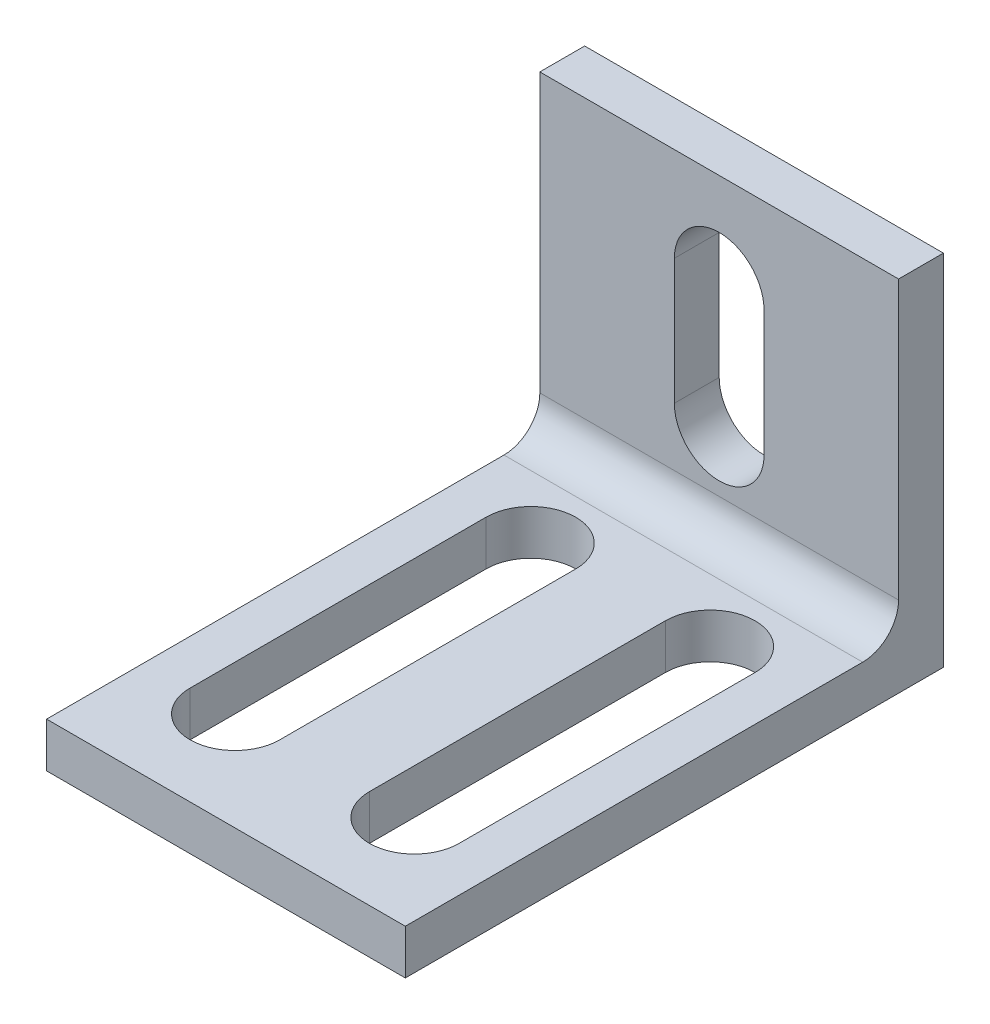
ISO-10303-21;
HEADER;
FILE_DESCRIPTION(('STEP AP214'),'2;1');
FILE_NAME('part.step','',(''),(''),'','','');
FILE_SCHEMA(('AUTOMOTIVE_DESIGN { 1 0 10303 214 1 1 1 1 }'));
ENDSEC;
DATA;
#1=APPLICATION_CONTEXT('core data for automotive mechanical design processes');
#2=APPLICATION_PROTOCOL_DEFINITION('international standard','automotive_design',2000,#1);
#3=PRODUCT_CONTEXT('',#1,'mechanical');
#4=PRODUCT('Part','Part','',(#3));
#5=PRODUCT_RELATED_PRODUCT_CATEGORY('part','',(#4));
#6=PRODUCT_DEFINITION_FORMATION('','',#4);
#7=PRODUCT_DEFINITION_CONTEXT('part definition',#1,'design');
#8=PRODUCT_DEFINITION('design','',#6,#7);
#9=PRODUCT_DEFINITION_SHAPE('','',#8);
#10=(LENGTH_UNIT() NAMED_UNIT(*) SI_UNIT(.MILLI.,.METRE.));
#11=(NAMED_UNIT(*) PLANE_ANGLE_UNIT() SI_UNIT($,.RADIAN.));
#12=(NAMED_UNIT(*) SI_UNIT($,.STERADIAN.) SOLID_ANGLE_UNIT());
#13=UNCERTAINTY_MEASURE_WITH_UNIT(LENGTH_MEASURE(1.E-05),#10,'distance_accuracy_value','');
#14=(GEOMETRIC_REPRESENTATION_CONTEXT(3) GLOBAL_UNCERTAINTY_ASSIGNED_CONTEXT((#13)) GLOBAL_UNIT_ASSIGNED_CONTEXT((#10,
#11,#12)) REPRESENTATION_CONTEXT('',''));
#15=CARTESIAN_POINT('',(0.,0.,0.));
#16=DIRECTION('',(0.,0.,1.));
#17=DIRECTION('',(1.,0.,0.));
#18=AXIS2_PLACEMENT_3D('',#15,#16,#17);
#19=CARTESIAN_POINT('',(12.7,12.7,-15.875));
#20=DIRECTION('',(0.,0.,-1.));
#21=DIRECTION('',(0.,1.,0.));
#22=AXIS2_PLACEMENT_3D('',#19,#20,#21);
#23=PLANE('',#22);
#24=DIRECTION('',(0.,1.,0.));
#25=VECTOR('',#24,1.);
#26=CARTESIAN_POINT('',(3.175,6.0325,-15.875));
#27=LINE('',#26,#25);
#28=CARTESIAN_POINT('',(3.175,-2.8575,-15.875));
#29=VERTEX_POINT('',#28);
#30=CARTESIAN_POINT('',(3.175,6.0325,-15.875));
#31=VERTEX_POINT('',#30);
#32=EDGE_CURVE('E237',#29,#31,#27,.T.);
#33=ORIENTED_EDGE('',*,*,#32,.F.);
#34=CARTESIAN_POINT('',(0.,-2.8575,-15.875));
#35=DIRECTION('',(0.,0.,1.));
#36=DIRECTION('',(1.,0.,0.));
#37=AXIS2_PLACEMENT_3D('',#34,#35,#36);
#38=CIRCLE('',#37,3.175);
#39=CARTESIAN_POINT('',(-3.175,-2.8575,-15.875));
#40=VERTEX_POINT('',#39);
#41=EDGE_CURVE('E199',#40,#29,#38,.T.);
#42=ORIENTED_EDGE('',*,*,#41,.F.);
#43=DIRECTION('',(0.,-1.,0.));
#44=VECTOR('',#43,1.);
#45=CARTESIAN_POINT('',(-3.175,6.0325,-15.875));
#46=LINE('',#45,#44);
#47=CARTESIAN_POINT('',(-3.175,6.0325,-15.875));
#48=VERTEX_POINT('',#47);
#49=EDGE_CURVE('E226',#48,#40,#46,.T.);
#50=ORIENTED_EDGE('',*,*,#49,.F.);
#51=CARTESIAN_POINT('',(0.,6.0325,-15.875));
#52=DIRECTION('',(0.,0.,1.));
#53=DIRECTION('',(1.,0.,0.));
#54=AXIS2_PLACEMENT_3D('',#51,#52,#53);
#55=CIRCLE('',#54,3.175);
#56=EDGE_CURVE('E240',#31,#48,#55,.T.);
#57=ORIENTED_EDGE('',*,*,#56,.F.);
#58=EDGE_LOOP('',(#33,#42,#50,#57));
#59=FACE_BOUND('',#58,.T.);
#60=DIRECTION('',(0.,-1.,0.));
#61=VECTOR('',#60,1.);
#62=CARTESIAN_POINT('',(-12.7,12.7,-15.875));
#63=LINE('',#62,#61);
#64=CARTESIAN_POINT('',(-12.7,12.7,-15.875));
#65=VERTEX_POINT('',#64);
#66=CARTESIAN_POINT('',(-12.7,-6.98499999999998,-15.875));
#67=VERTEX_POINT('',#66);
#68=EDGE_CURVE('E247',#65,#67,#63,.T.);
#69=ORIENTED_EDGE('',*,*,#68,.T.);
#70=DIRECTION('',(-1.,0.,0.));
#71=VECTOR('',#70,1.);
#72=CARTESIAN_POINT('',(12.7,-6.98499999999999,-15.875));
#73=LINE('',#72,#71);
#74=CARTESIAN_POINT('',(12.7,-6.98499999999998,-15.875));
#75=VERTEX_POINT('',#74);
#76=EDGE_CURVE('E50',#67,#75,#73,.F.);
#77=ORIENTED_EDGE('',*,*,#76,.T.);
#78=DIRECTION('',(0.,-1.,0.));
#79=VECTOR('',#78,1.);
#80=CARTESIAN_POINT('',(12.7,12.7,-15.875));
#81=LINE('',#80,#79);
#82=CARTESIAN_POINT('',(12.7,12.7,-15.875));
#83=VERTEX_POINT('',#82);
#84=EDGE_CURVE('E269',#83,#75,#81,.T.);
#85=ORIENTED_EDGE('',*,*,#84,.F.);
#86=DIRECTION('',(-1.,0.,0.));
#87=VECTOR('',#86,1.);
#88=CARTESIAN_POINT('',(12.7,12.7,-15.875));
#89=LINE('',#88,#87);
#90=EDGE_CURVE('E281',#83,#65,#89,.T.);
#91=ORIENTED_EDGE('',*,*,#90,.T.);
#92=EDGE_LOOP('',(#69,#77,#85,#91));
#93=FACE_BOUND('',#92,.T.);
#94=ADVANCED_FACE('F35',(#59,#93),#23,.F.);
#95=CARTESIAN_POINT('',(12.7,-9.52499999999999,-15.875));
#96=DIRECTION('',(0.,-1.,0.));
#97=DIRECTION('',(0.,0.,-1.));
#98=AXIS2_PLACEMENT_3D('',#95,#96,#97);
#99=PLANE('',#98);
#100=DIRECTION('',(0.,0.,1.));
#101=VECTOR('',#100,1.);
#102=CARTESIAN_POINT('',(-9.525,-9.52499999999999,-8.89000000000001));
#103=LINE('',#102,#101);
#104=CARTESIAN_POINT('',(-9.525,-9.52499999999999,-8.89000000000001));
#105=VERTEX_POINT('',#104);
#106=CARTESIAN_POINT('',(-9.525,-9.52499999999999,12.065));
#107=VERTEX_POINT('',#106);
#108=EDGE_CURVE('E182',#105,#107,#103,.T.);
#109=ORIENTED_EDGE('',*,*,#108,.F.);
#110=CARTESIAN_POINT('',(-6.35,-9.52499999999999,-8.89000000000001));
#111=DIRECTION('',(0.,1.,0.));
#112=DIRECTION('',(0.,0.,1.));
#113=AXIS2_PLACEMENT_3D('',#110,#111,#112);
#114=CIRCLE('',#113,3.175);
#115=CARTESIAN_POINT('',(-3.17500000000001,-9.52499999999999,-8.89000000000001));
#116=VERTEX_POINT('',#115);
#117=EDGE_CURVE('E187',#116,#105,#114,.T.);
#118=ORIENTED_EDGE('',*,*,#117,.F.);
#119=DIRECTION('',(0.,0.,-1.));
#120=VECTOR('',#119,1.);
#121=CARTESIAN_POINT('',(-3.17500000000001,-9.52499999999999,-8.89000000000001));
#122=LINE('',#121,#120);
#123=CARTESIAN_POINT('',(-3.17500000000001,-9.52499999999999,12.065));
#124=VERTEX_POINT('',#123);
#125=EDGE_CURVE('E192',#124,#116,#122,.T.);
#126=ORIENTED_EDGE('',*,*,#125,.F.);
#127=CARTESIAN_POINT('',(-6.35,-9.52499999999999,12.065));
#128=DIRECTION('',(0.,1.,0.));
#129=DIRECTION('',(0.,0.,1.));
#130=AXIS2_PLACEMENT_3D('',#127,#128,#129);
#131=CIRCLE('',#130,3.175);
#132=EDGE_CURVE('E171',#107,#124,#131,.T.);
#133=ORIENTED_EDGE('',*,*,#132,.F.);
#134=EDGE_LOOP('',(#109,#118,#126,#133));
#135=FACE_BOUND('',#134,.T.);
#136=DIRECTION('',(0.,0.,1.));
#137=VECTOR('',#136,1.);
#138=CARTESIAN_POINT('',(3.17500000000001,-9.52499999999999,-8.89000000000001));
#139=LINE('',#138,#137);
#140=CARTESIAN_POINT('',(3.17500000000001,-9.52499999999999,-8.89000000000001));
#141=VERTEX_POINT('',#140);
#142=CARTESIAN_POINT('',(3.17500000000001,-9.52499999999999,12.065));
#143=VERTEX_POINT('',#142);
#144=EDGE_CURVE('E204',#141,#143,#139,.T.);
#145=ORIENTED_EDGE('',*,*,#144,.F.);
#146=CARTESIAN_POINT('',(6.35,-9.52499999999999,-8.89000000000001));
#147=DIRECTION('',(0.,1.,0.));
#148=DIRECTION('',(0.,0.,-1.));
#149=AXIS2_PLACEMENT_3D('',#146,#147,#148);
#150=CIRCLE('',#149,3.175);
#151=CARTESIAN_POINT('',(9.52500000000001,-9.52499999999999,-8.89000000000001));
#152=VERTEX_POINT('',#151);
#153=EDGE_CURVE('E202',#152,#141,#150,.T.);
#154=ORIENTED_EDGE('',*,*,#153,.F.);
#155=DIRECTION('',(0.,0.,-1.));
#156=VECTOR('',#155,1.);
#157=CARTESIAN_POINT('',(9.52500000000001,-9.52499999999999,-8.89000000000001));
#158=LINE('',#157,#156);
#159=CARTESIAN_POINT('',(9.525,-9.52499999999999,12.065));
#160=VERTEX_POINT('',#159);
#161=EDGE_CURVE('E210',#160,#152,#158,.T.);
#162=ORIENTED_EDGE('',*,*,#161,.F.);
#163=CARTESIAN_POINT('',(6.35,-9.52499999999999,12.065));
#164=DIRECTION('',(0.,1.,0.));
#165=DIRECTION('',(0.,0.,-1.));
#166=AXIS2_PLACEMENT_3D('',#163,#164,#165);
#167=CIRCLE('',#166,3.175);
#168=EDGE_CURVE('E207',#143,#160,#167,.T.);
#169=ORIENTED_EDGE('',*,*,#168,.F.);
#170=EDGE_LOOP('',(#145,#154,#162,#169));
#171=FACE_BOUND('',#170,.T.);
#172=DIRECTION('',(0.,0.,1.));
#173=VECTOR('',#172,1.);
#174=CARTESIAN_POINT('',(12.7,-9.52499999999999,-15.875));
#175=LINE('',#174,#173);
#176=CARTESIAN_POINT('',(12.7,-9.52499999999999,-13.335));
#177=VERTEX_POINT('',#176);
#178=CARTESIAN_POINT('',(12.7,-9.52499999999999,19.05));
#179=VERTEX_POINT('',#178);
#180=EDGE_CURVE('E271',#177,#179,#175,.T.);
#181=ORIENTED_EDGE('',*,*,#180,.F.);
#182=DIRECTION('',(-1.,0.,0.));
#183=VECTOR('',#182,1.);
#184=CARTESIAN_POINT('',(-12.7,-9.52499999999999,-13.335));
#185=LINE('',#184,#183);
#186=CARTESIAN_POINT('',(-12.7,-9.52499999999999,-13.335));
#187=VERTEX_POINT('',#186);
#188=EDGE_CURVE('E313',#177,#187,#185,.T.);
#189=ORIENTED_EDGE('',*,*,#188,.T.);
#190=DIRECTION('',(0.,0.,1.));
#191=VECTOR('',#190,1.);
#192=CARTESIAN_POINT('',(-12.7,-9.52499999999999,-15.875));
#193=LINE('',#192,#191);
#194=CARTESIAN_POINT('',(-12.7,-9.52499999999999,19.05));
#195=VERTEX_POINT('',#194);
#196=EDGE_CURVE('E255',#187,#195,#193,.T.);
#197=ORIENTED_EDGE('',*,*,#196,.T.);
#198=DIRECTION('',(-1.,0.,0.));
#199=VECTOR('',#198,1.);
#200=CARTESIAN_POINT('',(12.7,-9.52499999999999,19.05));
#201=LINE('',#200,#199);
#202=EDGE_CURVE('E289',#179,#195,#201,.T.);
#203=ORIENTED_EDGE('',*,*,#202,.F.);
#204=EDGE_LOOP('',(#181,#189,#197,#203));
#205=FACE_BOUND('',#204,.T.);
#206=ADVANCED_FACE('F189',(#135,#171,#205),#99,.F.);
#207=CARTESIAN_POINT('',(12.7,-9.52499999999999,19.05));
#208=DIRECTION('',(0.,0.,-1.));
#209=DIRECTION('',(0.,1.,0.));
#210=AXIS2_PLACEMENT_3D('',#207,#208,#209);
#211=PLANE('',#210);
#212=ORIENTED_EDGE('',*,*,#202,.T.);
#213=DIRECTION('',(0.,-1.,0.));
#214=VECTOR('',#213,1.);
#215=CARTESIAN_POINT('',(-12.7,-9.52499999999999,19.05));
#216=LINE('',#215,#214);
#217=CARTESIAN_POINT('',(-12.7,-12.7,19.05));
#218=VERTEX_POINT('',#217);
#219=EDGE_CURVE('E257',#195,#218,#216,.T.);
#220=ORIENTED_EDGE('',*,*,#219,.T.);
#221=DIRECTION('',(-1.,0.,0.));
#222=VECTOR('',#221,1.);
#223=CARTESIAN_POINT('',(12.7,-12.7,19.05));
#224=LINE('',#223,#222);
#225=CARTESIAN_POINT('',(12.7,-12.7,19.05));
#226=VERTEX_POINT('',#225);
#227=EDGE_CURVE('E287',#226,#218,#224,.T.);
#228=ORIENTED_EDGE('',*,*,#227,.F.);
#229=DIRECTION('',(0.,-1.,0.));
#230=VECTOR('',#229,1.);
#231=CARTESIAN_POINT('',(12.7,-9.52499999999999,19.05));
#232=LINE('',#231,#230);
#233=EDGE_CURVE('E273',#179,#226,#232,.T.);
#234=ORIENTED_EDGE('',*,*,#233,.F.);
#235=EDGE_LOOP('',(#212,#220,#228,#234));
#236=FACE_BOUND('',#235,.T.);
#237=ADVANCED_FACE('F328',(#236),#211,.F.);
#238=CARTESIAN_POINT('',(12.7,-12.7,-19.05));
#239=DIRECTION('',(0.,1.,0.));
#240=DIRECTION('',(0.,0.,1.));
#241=AXIS2_PLACEMENT_3D('',#238,#239,#240);
#242=PLANE('',#241);
#243=DIRECTION('',(0.,0.,-1.));
#244=VECTOR('',#243,1.);
#245=CARTESIAN_POINT('',(-3.17500000000001,-12.7,-19.05));
#246=LINE('',#245,#244);
#247=CARTESIAN_POINT('',(-3.17500000000001,-12.7,12.065));
#248=VERTEX_POINT('',#247);
#249=CARTESIAN_POINT('',(-3.17500000000001,-12.7,-8.89000000000001));
#250=VERTEX_POINT('',#249);
#251=EDGE_CURVE('E307',#248,#250,#246,.T.);
#252=ORIENTED_EDGE('',*,*,#251,.T.);
#253=CARTESIAN_POINT('',(-6.35,-12.7,-8.89000000000001));
#254=DIRECTION('',(0.,1.,0.));
#255=DIRECTION('',(0.,0.,1.));
#256=AXIS2_PLACEMENT_3D('',#253,#254,#255);
#257=CIRCLE('',#256,3.175);
#258=CARTESIAN_POINT('',(-9.525,-12.7,-8.89000000000001));
#259=VERTEX_POINT('',#258);
#260=EDGE_CURVE('E310',#250,#259,#257,.T.);
#261=ORIENTED_EDGE('',*,*,#260,.T.);
#262=DIRECTION('',(0.,0.,1.));
#263=VECTOR('',#262,1.);
#264=CARTESIAN_POINT('',(-9.525,-12.7,-19.05));
#265=LINE('',#264,#263);
#266=CARTESIAN_POINT('',(-9.525,-12.7,12.065));
#267=VERTEX_POINT('',#266);
#268=EDGE_CURVE('E304',#259,#267,#265,.T.);
#269=ORIENTED_EDGE('',*,*,#268,.T.);
#270=CARTESIAN_POINT('',(-6.35,-12.7,12.065));
#271=DIRECTION('',(0.,1.,0.));
#272=DIRECTION('',(0.,0.,1.));
#273=AXIS2_PLACEMENT_3D('',#270,#271,#272);
#274=CIRCLE('',#273,3.175);
#275=EDGE_CURVE('E174',#267,#248,#274,.T.);
#276=ORIENTED_EDGE('',*,*,#275,.T.);
#277=EDGE_LOOP('',(#252,#261,#269,#276));
#278=FACE_BOUND('',#277,.T.);
#279=DIRECTION('',(0.,0.,-1.));
#280=VECTOR('',#279,1.);
#281=CARTESIAN_POINT('',(9.52500000000001,-12.7,-19.05));
#282=LINE('',#281,#280);
#283=CARTESIAN_POINT('',(9.525,-12.7,12.065));
#284=VERTEX_POINT('',#283);
#285=CARTESIAN_POINT('',(9.52500000000001,-12.7,-8.89000000000001));
#286=VERTEX_POINT('',#285);
#287=EDGE_CURVE('E298',#284,#286,#282,.T.);
#288=ORIENTED_EDGE('',*,*,#287,.T.);
#289=CARTESIAN_POINT('',(6.35,-12.7,-8.89000000000001));
#290=DIRECTION('',(0.,1.,0.));
#291=DIRECTION('',(0.,0.,1.));
#292=AXIS2_PLACEMENT_3D('',#289,#290,#291);
#293=CIRCLE('',#292,3.175);
#294=CARTESIAN_POINT('',(3.17500000000001,-12.7,-8.89000000000001));
#295=VERTEX_POINT('',#294);
#296=EDGE_CURVE('E301',#286,#295,#293,.T.);
#297=ORIENTED_EDGE('',*,*,#296,.T.);
#298=DIRECTION('',(0.,0.,1.));
#299=VECTOR('',#298,1.);
#300=CARTESIAN_POINT('',(3.17500000000001,-12.7,-19.05));
#301=LINE('',#300,#299);
#302=CARTESIAN_POINT('',(3.17500000000001,-12.7,12.065));
#303=VERTEX_POINT('',#302);
#304=EDGE_CURVE('E292',#295,#303,#301,.T.);
#305=ORIENTED_EDGE('',*,*,#304,.T.);
#306=CARTESIAN_POINT('',(6.35,-12.7,12.065));
#307=DIRECTION('',(0.,1.,0.));
#308=DIRECTION('',(0.,0.,1.));
#309=AXIS2_PLACEMENT_3D('',#306,#307,#308);
#310=CIRCLE('',#309,3.175);
#311=EDGE_CURVE('E295',#303,#284,#310,.T.);
#312=ORIENTED_EDGE('',*,*,#311,.T.);
#313=EDGE_LOOP('',(#288,#297,#305,#312));
#314=FACE_BOUND('',#313,.T.);
#315=ORIENTED_EDGE('',*,*,#227,.T.);
#316=DIRECTION('',(0.,0.,-1.));
#317=VECTOR('',#316,1.);
#318=CARTESIAN_POINT('',(-12.7,-12.7,-19.05));
#319=LINE('',#318,#317);
#320=CARTESIAN_POINT('',(-12.7,-12.7,-19.05));
#321=VERTEX_POINT('',#320);
#322=EDGE_CURVE('E260',#218,#321,#319,.T.);
#323=ORIENTED_EDGE('',*,*,#322,.T.);
#324=DIRECTION('',(-1.,0.,0.));
#325=VECTOR('',#324,1.);
#326=CARTESIAN_POINT('',(12.7,-12.7,-19.05));
#327=LINE('',#326,#325);
#328=CARTESIAN_POINT('',(12.7,-12.7,-19.05));
#329=VERTEX_POINT('',#328);
#330=EDGE_CURVE('E285',#329,#321,#327,.T.);
#331=ORIENTED_EDGE('',*,*,#330,.F.);
#332=DIRECTION('',(0.,0.,-1.));
#333=VECTOR('',#332,1.);
#334=CARTESIAN_POINT('',(12.7,-12.7,-19.05));
#335=LINE('',#334,#333);
#336=EDGE_CURVE('E275',#226,#329,#335,.T.);
#337=ORIENTED_EDGE('',*,*,#336,.F.);
#338=EDGE_LOOP('',(#315,#323,#331,#337));
#339=FACE_BOUND('',#338,.T.);
#340=ADVANCED_FACE('F349',(#278,#314,#339),#242,.F.);
#341=CARTESIAN_POINT('',(12.7,12.7,-19.05));
#342=DIRECTION('',(0.,0.,1.));
#343=DIRECTION('',(1.,0.,0.));
#344=AXIS2_PLACEMENT_3D('',#341,#342,#343);
#345=PLANE('',#344);
#346=DIRECTION('',(0.,-1.,0.));
#347=VECTOR('',#346,1.);
#348=CARTESIAN_POINT('',(-3.175,6.0325,-19.05));
#349=LINE('',#348,#347);
#350=CARTESIAN_POINT('',(-3.175,6.0325,-19.05));
#351=VERTEX_POINT('',#350);
#352=CARTESIAN_POINT('',(-3.175,-2.8575,-19.05));
#353=VERTEX_POINT('',#352);
#354=EDGE_CURVE('E232',#351,#353,#349,.T.);
#355=ORIENTED_EDGE('',*,*,#354,.T.);
#356=CARTESIAN_POINT('',(0.,-2.8575,-19.05));
#357=DIRECTION('',(0.,0.,1.));
#358=DIRECTION('',(1.,0.,0.));
#359=AXIS2_PLACEMENT_3D('',#356,#357,#358);
#360=CIRCLE('',#359,3.175);
#361=CARTESIAN_POINT('',(3.175,-2.8575,-19.05));
#362=VERTEX_POINT('',#361);
#363=EDGE_CURVE('E222',#353,#362,#360,.T.);
#364=ORIENTED_EDGE('',*,*,#363,.T.);
#365=DIRECTION('',(0.,1.,0.));
#366=VECTOR('',#365,1.);
#367=CARTESIAN_POINT('',(3.175,6.0325,-19.05));
#368=LINE('',#367,#366);
#369=CARTESIAN_POINT('',(3.175,6.0325,-19.05));
#370=VERTEX_POINT('',#369);
#371=EDGE_CURVE('E225',#362,#370,#368,.T.);
#372=ORIENTED_EDGE('',*,*,#371,.T.);
#373=CARTESIAN_POINT('',(0.,6.0325,-19.05));
#374=DIRECTION('',(0.,0.,1.));
#375=DIRECTION('',(1.,0.,0.));
#376=AXIS2_PLACEMENT_3D('',#373,#374,#375);
#377=CIRCLE('',#376,3.175);
#378=EDGE_CURVE('E229',#370,#351,#377,.T.);
#379=ORIENTED_EDGE('',*,*,#378,.T.);
#380=EDGE_LOOP('',(#355,#364,#372,#379));
#381=FACE_BOUND('',#380,.T.);
#382=ORIENTED_EDGE('',*,*,#330,.T.);
#383=DIRECTION('',(0.,1.,0.));
#384=VECTOR('',#383,1.);
#385=CARTESIAN_POINT('',(-12.7,12.7,-19.05));
#386=LINE('',#385,#384);
#387=CARTESIAN_POINT('',(-12.7,12.7,-19.05));
#388=VERTEX_POINT('',#387);
#389=EDGE_CURVE('E263',#321,#388,#386,.T.);
#390=ORIENTED_EDGE('',*,*,#389,.T.);
#391=DIRECTION('',(-1.,0.,0.));
#392=VECTOR('',#391,1.);
#393=CARTESIAN_POINT('',(12.7,12.7,-19.05));
#394=LINE('',#393,#392);
#395=CARTESIAN_POINT('',(12.7,12.7,-19.05));
#396=VERTEX_POINT('',#395);
#397=EDGE_CURVE('E283',#396,#388,#394,.T.);
#398=ORIENTED_EDGE('',*,*,#397,.F.);
#399=DIRECTION('',(0.,1.,0.));
#400=VECTOR('',#399,1.);
#401=CARTESIAN_POINT('',(12.7,12.7,-19.05));
#402=LINE('',#401,#400);
#403=EDGE_CURVE('E277',#329,#396,#402,.T.);
#404=ORIENTED_EDGE('',*,*,#403,.F.);
#405=EDGE_LOOP('',(#382,#390,#398,#404));
#406=FACE_BOUND('',#405,.T.);
#407=ADVANCED_FACE('F352',(#381,#406),#345,.F.);
#408=CARTESIAN_POINT('',(12.7,12.7,-15.875));
#409=DIRECTION('',(0.,-1.,0.));
#410=DIRECTION('',(0.,0.,-1.));
#411=AXIS2_PLACEMENT_3D('',#408,#409,#410);
#412=PLANE('',#411);
#413=ORIENTED_EDGE('',*,*,#397,.T.);
#414=DIRECTION('',(0.,0.,1.));
#415=VECTOR('',#414,1.);
#416=CARTESIAN_POINT('',(-12.7,12.7,-15.875));
#417=LINE('',#416,#415);
#418=EDGE_CURVE('E266',#388,#65,#417,.T.);
#419=ORIENTED_EDGE('',*,*,#418,.T.);
#420=ORIENTED_EDGE('',*,*,#90,.F.);
#421=DIRECTION('',(0.,0.,1.));
#422=VECTOR('',#421,1.);
#423=CARTESIAN_POINT('',(12.7,12.7,-15.875));
#424=LINE('',#423,#422);
#425=EDGE_CURVE('E279',#396,#83,#424,.T.);
#426=ORIENTED_EDGE('',*,*,#425,.F.);
#427=EDGE_LOOP('',(#413,#419,#420,#426));
#428=FACE_BOUND('',#427,.T.);
#429=ADVANCED_FACE('F356',(#428),#412,.F.);
#430=CARTESIAN_POINT('',(12.7,0.,0.));
#431=DIRECTION('',(-1.,0.,0.));
#432=DIRECTION('',(0.,0.,1.));
#433=AXIS2_PLACEMENT_3D('',#430,#431,#432);
#434=PLANE('',#433);
#435=ORIENTED_EDGE('',*,*,#84,.T.);
#436=CARTESIAN_POINT('',(12.7,-6.98499999999999,-13.335));
#437=DIRECTION('',(-1.,0.,0.));
#438=DIRECTION('',(0.,0.,1.));
#439=AXIS2_PLACEMENT_3D('',#436,#437,#438);
#440=CIRCLE('',#439,2.54);
#441=EDGE_CURVE('E11',#75,#177,#440,.T.);
#442=ORIENTED_EDGE('',*,*,#441,.T.);
#443=ORIENTED_EDGE('',*,*,#180,.T.);
#444=ORIENTED_EDGE('',*,*,#233,.T.);
#445=ORIENTED_EDGE('',*,*,#336,.T.);
#446=ORIENTED_EDGE('',*,*,#403,.T.);
#447=ORIENTED_EDGE('',*,*,#425,.T.);
#448=EDGE_LOOP('',(#435,#442,#443,#444,#445,#446,#447));
#449=FACE_BOUND('',#448,.T.);
#450=ADVANCED_FACE('F332',(#449),#434,.F.);
#451=CARTESIAN_POINT('',(-12.7,0.,0.));
#452=DIRECTION('',(-1.,0.,0.));
#453=DIRECTION('',(0.,0.,1.));
#454=AXIS2_PLACEMENT_3D('',#451,#452,#453);
#455=PLANE('',#454);
#456=ORIENTED_EDGE('',*,*,#68,.F.);
#457=ORIENTED_EDGE('',*,*,#418,.F.);
#458=ORIENTED_EDGE('',*,*,#389,.F.);
#459=ORIENTED_EDGE('',*,*,#322,.F.);
#460=ORIENTED_EDGE('',*,*,#219,.F.);
#461=ORIENTED_EDGE('',*,*,#196,.F.);
#462=CARTESIAN_POINT('',(-12.7,-6.98499999999999,-13.335));
#463=DIRECTION('',(-1.,0.,0.));
#464=DIRECTION('',(0.,0.,1.));
#465=AXIS2_PLACEMENT_3D('',#462,#463,#464);
#466=CIRCLE('',#465,2.54);
#467=EDGE_CURVE('E43',#187,#67,#466,.F.);
#468=ORIENTED_EDGE('',*,*,#467,.T.);
#469=EDGE_LOOP('',(#456,#457,#458,#459,#460,#461,#468));
#470=FACE_BOUND('',#469,.T.);
#471=ADVANCED_FACE('F323',(#470),#455,.T.);
#472=CARTESIAN_POINT('',(0.,-2.8575,-19.05));
#473=DIRECTION('',(0.,0.,1.));
#474=DIRECTION('',(1.,0.,0.));
#475=AXIS2_PLACEMENT_3D('',#472,#473,#474);
#476=CYLINDRICAL_SURFACE('',#475,3.175);
#477=ORIENTED_EDGE('',*,*,#41,.T.);
#478=DIRECTION('',(0.,0.,1.));
#479=VECTOR('',#478,1.);
#480=CARTESIAN_POINT('',(3.175,-2.8575,-19.05));
#481=LINE('',#480,#479);
#482=EDGE_CURVE('E235',#362,#29,#481,.T.);
#483=ORIENTED_EDGE('',*,*,#482,.F.);
#484=ORIENTED_EDGE('',*,*,#363,.F.);
#485=DIRECTION('',(0.,0.,1.));
#486=VECTOR('',#485,1.);
#487=CARTESIAN_POINT('',(-3.175,-2.8575,-19.05));
#488=LINE('',#487,#486);
#489=EDGE_CURVE('E245',#353,#40,#488,.T.);
#490=ORIENTED_EDGE('',*,*,#489,.T.);
#491=EDGE_LOOP('',(#477,#483,#484,#490));
#492=FACE_BOUND('',#491,.T.);
#493=ADVANCED_FACE('F365',(#492),#476,.F.);
#494=CARTESIAN_POINT('',(-3.175,6.0325,-19.05));
#495=DIRECTION('',(-1.,0.,0.));
#496=DIRECTION('',(0.,-1.,0.));
#497=AXIS2_PLACEMENT_3D('',#494,#495,#496);
#498=PLANE('',#497);
#499=ORIENTED_EDGE('',*,*,#49,.T.);
#500=ORIENTED_EDGE('',*,*,#489,.F.);
#501=ORIENTED_EDGE('',*,*,#354,.F.);
#502=DIRECTION('',(0.,0.,1.));
#503=VECTOR('',#502,1.);
#504=CARTESIAN_POINT('',(-3.175,6.0325,-19.05));
#505=LINE('',#504,#503);
#506=EDGE_CURVE('E248',#351,#48,#505,.T.);
#507=ORIENTED_EDGE('',*,*,#506,.T.);
#508=EDGE_LOOP('',(#499,#500,#501,#507));
#509=FACE_BOUND('',#508,.T.);
#510=ADVANCED_FACE('F368',(#509),#498,.F.);
#511=CARTESIAN_POINT('',(0.,6.0325,-19.05));
#512=DIRECTION('',(0.,0.,1.));
#513=DIRECTION('',(1.,0.,0.));
#514=AXIS2_PLACEMENT_3D('',#511,#512,#513);
#515=CYLINDRICAL_SURFACE('',#514,3.175);
#516=ORIENTED_EDGE('',*,*,#56,.T.);
#517=ORIENTED_EDGE('',*,*,#506,.F.);
#518=ORIENTED_EDGE('',*,*,#378,.F.);
#519=DIRECTION('',(0.,0.,1.));
#520=VECTOR('',#519,1.);
#521=CARTESIAN_POINT('',(3.175,6.0325,-19.05));
#522=LINE('',#521,#520);
#523=EDGE_CURVE('E250',#370,#31,#522,.T.);
#524=ORIENTED_EDGE('',*,*,#523,.T.);
#525=EDGE_LOOP('',(#516,#517,#518,#524));
#526=FACE_BOUND('',#525,.T.);
#527=ADVANCED_FACE('F374',(#526),#515,.F.);
#528=CARTESIAN_POINT('',(3.175,6.0325,-19.05));
#529=DIRECTION('',(1.,0.,0.));
#530=DIRECTION('',(0.,1.,0.));
#531=AXIS2_PLACEMENT_3D('',#528,#529,#530);
#532=PLANE('',#531);
#533=ORIENTED_EDGE('',*,*,#32,.T.);
#534=ORIENTED_EDGE('',*,*,#523,.F.);
#535=ORIENTED_EDGE('',*,*,#371,.F.);
#536=ORIENTED_EDGE('',*,*,#482,.T.);
#537=EDGE_LOOP('',(#533,#534,#535,#536));
#538=FACE_BOUND('',#537,.T.);
#539=ADVANCED_FACE('F370',(#538),#532,.F.);
#540=CARTESIAN_POINT('',(6.35,-47.625,-8.89000000000001));
#541=DIRECTION('',(0.,1.,0.));
#542=DIRECTION('',(0.,0.,1.));
#543=AXIS2_PLACEMENT_3D('',#540,#541,#542);
#544=CYLINDRICAL_SURFACE('',#543,3.175);
#545=DIRECTION('',(0.,1.,0.));
#546=VECTOR('',#545,1.);
#547=CARTESIAN_POINT('',(9.52500000000001,-47.625,-8.89000000000001));
#548=LINE('',#547,#546);
#549=EDGE_CURVE('E214',#286,#152,#548,.T.);
#550=ORIENTED_EDGE('',*,*,#549,.T.);
#551=ORIENTED_EDGE('',*,*,#153,.T.);
#552=DIRECTION('',(0.,1.,0.));
#553=VECTOR('',#552,1.);
#554=CARTESIAN_POINT('',(3.17500000000001,-47.625,-8.89000000000001));
#555=LINE('',#554,#553);
#556=EDGE_CURVE('E213',#295,#141,#555,.T.);
#557=ORIENTED_EDGE('',*,*,#556,.F.);
#558=ORIENTED_EDGE('',*,*,#296,.F.);
#559=EDGE_LOOP('',(#550,#551,#557,#558));
#560=FACE_BOUND('',#559,.T.);
#561=ADVANCED_FACE('F373',(#560),#544,.F.);
#562=CARTESIAN_POINT('',(9.52500000000001,-47.625,-8.89000000000001));
#563=DIRECTION('',(1.,0.,0.));
#564=DIRECTION('',(0.,0.,-1.));
#565=AXIS2_PLACEMENT_3D('',#562,#563,#564);
#566=PLANE('',#565);
#567=DIRECTION('',(0.,1.,0.));
#568=VECTOR('',#567,1.);
#569=CARTESIAN_POINT('',(9.525,-47.625,12.065));
#570=LINE('',#569,#568);
#571=EDGE_CURVE('E216',#284,#160,#570,.T.);
#572=ORIENTED_EDGE('',*,*,#571,.T.);
#573=ORIENTED_EDGE('',*,*,#161,.T.);
#574=ORIENTED_EDGE('',*,*,#549,.F.);
#575=ORIENTED_EDGE('',*,*,#287,.F.);
#576=EDGE_LOOP('',(#572,#573,#574,#575));
#577=FACE_BOUND('',#576,.T.);
#578=ADVANCED_FACE('F384',(#577),#566,.F.);
#579=CARTESIAN_POINT('',(6.35,-47.625,12.065));
#580=DIRECTION('',(0.,1.,0.));
#581=DIRECTION('',(0.,0.,1.));
#582=AXIS2_PLACEMENT_3D('',#579,#580,#581);
#583=CYLINDRICAL_SURFACE('',#582,3.175);
#584=DIRECTION('',(0.,1.,0.));
#585=VECTOR('',#584,1.);
#586=CARTESIAN_POINT('',(3.17500000000001,-47.625,12.065));
#587=LINE('',#586,#585);
#588=EDGE_CURVE('E218',#303,#143,#587,.T.);
#589=ORIENTED_EDGE('',*,*,#588,.T.);
#590=ORIENTED_EDGE('',*,*,#168,.T.);
#591=ORIENTED_EDGE('',*,*,#571,.F.);
#592=ORIENTED_EDGE('',*,*,#311,.F.);
#593=EDGE_LOOP('',(#589,#590,#591,#592));
#594=FACE_BOUND('',#593,.T.);
#595=ADVANCED_FACE('F390',(#594),#583,.F.);
#596=CARTESIAN_POINT('',(3.17500000000001,-47.625,-8.89000000000001));
#597=DIRECTION('',(-1.,0.,0.));
#598=DIRECTION('',(0.,0.,1.));
#599=AXIS2_PLACEMENT_3D('',#596,#597,#598);
#600=PLANE('',#599);
#601=ORIENTED_EDGE('',*,*,#556,.T.);
#602=ORIENTED_EDGE('',*,*,#144,.T.);
#603=ORIENTED_EDGE('',*,*,#588,.F.);
#604=ORIENTED_EDGE('',*,*,#304,.F.);
#605=EDGE_LOOP('',(#601,#602,#603,#604));
#606=FACE_BOUND('',#605,.T.);
#607=ADVANCED_FACE('F386',(#606),#600,.F.);
#608=CARTESIAN_POINT('',(-6.35,-47.625,-8.89000000000001));
#609=DIRECTION('',(0.,1.,0.));
#610=DIRECTION('',(0.,0.,1.));
#611=AXIS2_PLACEMENT_3D('',#608,#609,#610);
#612=CYLINDRICAL_SURFACE('',#611,3.175);
#613=DIRECTION('',(0.,1.,0.));
#614=VECTOR('',#613,1.);
#615=CARTESIAN_POINT('',(-3.17500000000001,-47.625,-8.89000000000001));
#616=LINE('',#615,#614);
#617=EDGE_CURVE('E197',#250,#116,#616,.T.);
#618=ORIENTED_EDGE('',*,*,#617,.T.);
#619=ORIENTED_EDGE('',*,*,#117,.T.);
#620=DIRECTION('',(0.,1.,0.));
#621=VECTOR('',#620,1.);
#622=CARTESIAN_POINT('',(-9.525,-47.625,-8.89000000000001));
#623=LINE('',#622,#621);
#624=EDGE_CURVE('E178',#259,#105,#623,.T.);
#625=ORIENTED_EDGE('',*,*,#624,.F.);
#626=ORIENTED_EDGE('',*,*,#260,.F.);
#627=EDGE_LOOP('',(#618,#619,#625,#626));
#628=FACE_BOUND('',#627,.T.);
#629=ADVANCED_FACE('F389',(#628),#612,.F.);
#630=CARTESIAN_POINT('',(-3.17500000000001,-47.625,-8.89000000000001));
#631=DIRECTION('',(1.,0.,0.));
#632=DIRECTION('',(0.,0.,-1.));
#633=AXIS2_PLACEMENT_3D('',#630,#631,#632);
#634=PLANE('',#633);
#635=DIRECTION('',(0.,1.,0.));
#636=VECTOR('',#635,1.);
#637=CARTESIAN_POINT('',(-3.17500000000001,-47.625,12.065));
#638=LINE('',#637,#636);
#639=EDGE_CURVE('E177',#248,#124,#638,.T.);
#640=ORIENTED_EDGE('',*,*,#639,.T.);
#641=ORIENTED_EDGE('',*,*,#125,.T.);
#642=ORIENTED_EDGE('',*,*,#617,.F.);
#643=ORIENTED_EDGE('',*,*,#251,.F.);
#644=EDGE_LOOP('',(#640,#641,#642,#643));
#645=FACE_BOUND('',#644,.T.);
#646=ADVANCED_FACE('F399',(#645),#634,.F.);
#647=CARTESIAN_POINT('',(-6.35,-47.625,12.065));
#648=DIRECTION('',(0.,1.,0.));
#649=DIRECTION('',(0.,0.,1.));
#650=AXIS2_PLACEMENT_3D('',#647,#648,#649);
#651=CYLINDRICAL_SURFACE('',#650,3.175);
#652=DIRECTION('',(0.,1.,0.));
#653=VECTOR('',#652,1.);
#654=CARTESIAN_POINT('',(-9.525,-47.625,12.065));
#655=LINE('',#654,#653);
#656=EDGE_CURVE('E166',#267,#107,#655,.T.);
#657=ORIENTED_EDGE('',*,*,#656,.T.);
#658=ORIENTED_EDGE('',*,*,#132,.T.);
#659=ORIENTED_EDGE('',*,*,#639,.F.);
#660=ORIENTED_EDGE('',*,*,#275,.F.);
#661=EDGE_LOOP('',(#657,#658,#659,#660));
#662=FACE_BOUND('',#661,.T.);
#663=ADVANCED_FACE('F168',(#662),#651,.F.);
#664=CARTESIAN_POINT('',(-9.525,-47.625,-8.89000000000001));
#665=DIRECTION('',(-1.,0.,0.));
#666=DIRECTION('',(0.,0.,1.));
#667=AXIS2_PLACEMENT_3D('',#664,#665,#666);
#668=PLANE('',#667);
#669=ORIENTED_EDGE('',*,*,#624,.T.);
#670=ORIENTED_EDGE('',*,*,#108,.T.);
#671=ORIENTED_EDGE('',*,*,#656,.F.);
#672=ORIENTED_EDGE('',*,*,#268,.F.);
#673=EDGE_LOOP('',(#669,#670,#671,#672));
#674=FACE_BOUND('',#673,.T.);
#675=ADVANCED_FACE('F183',(#674),#668,.F.);
#676=CARTESIAN_POINT('',(12.7,-6.98499999999999,-13.335));
#677=DIRECTION('',(1.,0.,0.));
#678=DIRECTION('',(0.,0.,-1.));
#679=AXIS2_PLACEMENT_3D('',#676,#677,#678);
#680=CYLINDRICAL_SURFACE('',#679,2.54);
#681=ORIENTED_EDGE('',*,*,#441,.F.);
#682=ORIENTED_EDGE('',*,*,#76,.F.);
#683=ORIENTED_EDGE('',*,*,#467,.F.);
#684=ORIENTED_EDGE('',*,*,#188,.F.);
#685=EDGE_LOOP('',(#681,#682,#683,#684));
#686=FACE_BOUND('',#685,.T.);
#687=ADVANCED_FACE('F37',(#686),#680,.F.);
#688=CLOSED_SHELL('',(#94,#206,#237,#340,#407,#429,#450,#471,#493,#510,#527,#539,#561,#578,#595,
#607,#629,#646,#663,#675,#687));
#689=MANIFOLD_SOLID_BREP('B2',#688);
#690=ADVANCED_BREP_SHAPE_REPRESENTATION('',(#18,#689),#14);
#691=SHAPE_DEFINITION_REPRESENTATION(#9,#690);
ENDSEC;
END-ISO-10303-21;
